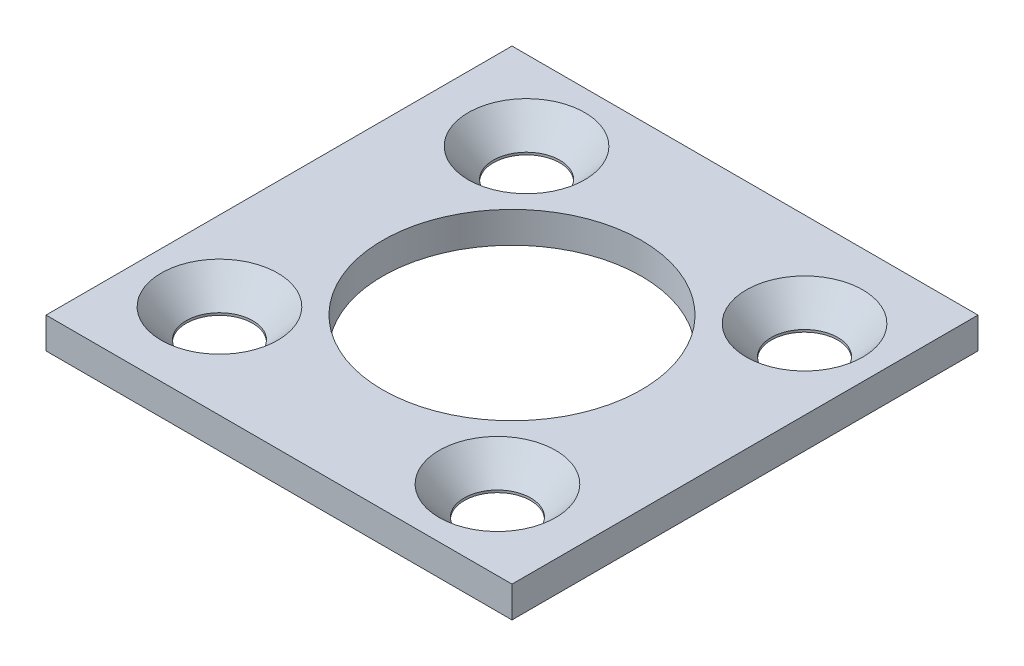
ISO-10303-21;
HEADER;
FILE_DESCRIPTION(('STEP AP214'),'2;1');
FILE_NAME('part.step','',(''),(''),'','','');
FILE_SCHEMA(('AUTOMOTIVE_DESIGN { 1 0 10303 214 1 1 1 1 }'));
ENDSEC;
DATA;
#1=APPLICATION_CONTEXT('core data for automotive mechanical design processes');
#2=APPLICATION_PROTOCOL_DEFINITION('international standard','automotive_design',2000,#1);
#3=PRODUCT_CONTEXT('',#1,'mechanical');
#4=PRODUCT('Part','Part','',(#3));
#5=PRODUCT_RELATED_PRODUCT_CATEGORY('part','',(#4));
#6=PRODUCT_DEFINITION_FORMATION('','',#4);
#7=PRODUCT_DEFINITION_CONTEXT('part definition',#1,'design');
#8=PRODUCT_DEFINITION('design','',#6,#7);
#9=PRODUCT_DEFINITION_SHAPE('','',#8);
#10=(LENGTH_UNIT() NAMED_UNIT(*) SI_UNIT(.MILLI.,.METRE.));
#11=(NAMED_UNIT(*) PLANE_ANGLE_UNIT() SI_UNIT($,.RADIAN.));
#12=(NAMED_UNIT(*) SI_UNIT($,.STERADIAN.) SOLID_ANGLE_UNIT());
#13=UNCERTAINTY_MEASURE_WITH_UNIT(LENGTH_MEASURE(1.E-05),#10,'distance_accuracy_value','');
#14=(GEOMETRIC_REPRESENTATION_CONTEXT(3) GLOBAL_UNCERTAINTY_ASSIGNED_CONTEXT((#13)) GLOBAL_UNIT_ASSIGNED_CONTEXT((#10,
#11,#12)) REPRESENTATION_CONTEXT('',''));
#15=CARTESIAN_POINT('',(0.,0.,0.));
#16=DIRECTION('',(0.,0.,1.));
#17=DIRECTION('',(1.,0.,0.));
#18=AXIS2_PLACEMENT_3D('',#15,#16,#17);
#19=CARTESIAN_POINT('',(0.,1.524,0.));
#20=DIRECTION('',(0.,1.,0.));
#21=DIRECTION('',(0.,0.,1.));
#22=AXIS2_PLACEMENT_3D('',#19,#20,#21);
#23=PLANE('',#22);
#24=CARTESIAN_POINT('',(-3.89772465493816,1.524,-18.2483889685302));
#25=DIRECTION('',(0.,1.,0.));
#26=DIRECTION('',(0.,0.,1.));
#27=AXIS2_PLACEMENT_3D('',#24,#25,#26);
#28=CIRCLE('',#27,2.8575);
#29=CARTESIAN_POINT('',(-3.89772465493816,1.524,-15.3908889685302));
#30=VERTEX_POINT('',#29);
#31=EDGE_CURVE('E150',#30,#30,#28,.T.);
#32=ORIENTED_EDGE('',*,*,#31,.F.);
#33=EDGE_LOOP('',(#32));
#34=FACE_BOUND('',#33,.T.);
#35=CARTESIAN_POINT('',(-4.61161103146986,1.524,-3.89772465493815));
#36=DIRECTION('',(0.,1.,0.));
#37=DIRECTION('',(0.,0.,1.));
#38=AXIS2_PLACEMENT_3D('',#35,#36,#37);
#39=CIRCLE('',#38,2.8575);
#40=CARTESIAN_POINT('',(-4.61161103146986,1.524,-1.04022465493815));
#41=VERTEX_POINT('',#40);
#42=EDGE_CURVE('E141',#41,#41,#39,.T.);
#43=ORIENTED_EDGE('',*,*,#42,.F.);
#44=EDGE_LOOP('',(#43));
#45=FACE_BOUND('',#44,.T.);
#46=CARTESIAN_POINT('',(-18.9622753450619,1.524,-4.61161103146984));
#47=DIRECTION('',(0.,1.,0.));
#48=DIRECTION('',(0.,0.,1.));
#49=AXIS2_PLACEMENT_3D('',#46,#47,#48);
#50=CIRCLE('',#49,2.8575);
#51=CARTESIAN_POINT('',(-18.9622753450619,1.524,-1.75411103146984));
#52=VERTEX_POINT('',#51);
#53=EDGE_CURVE('E132',#52,#52,#50,.T.);
#54=ORIENTED_EDGE('',*,*,#53,.F.);
#55=EDGE_LOOP('',(#54));
#56=FACE_BOUND('',#55,.T.);
#57=CARTESIAN_POINT('',(-18.2483889685302,1.524,-18.9622753450618));
#58=DIRECTION('',(0.,1.,0.));
#59=DIRECTION('',(0.,0.,1.));
#60=AXIS2_PLACEMENT_3D('',#57,#58,#59);
#61=CIRCLE('',#60,2.8575);
#62=CARTESIAN_POINT('',(-18.2483889685302,1.524,-16.1047753450618));
#63=VERTEX_POINT('',#62);
#64=EDGE_CURVE('E123',#63,#63,#61,.T.);
#65=ORIENTED_EDGE('',*,*,#64,.F.);
#66=EDGE_LOOP('',(#65));
#67=FACE_BOUND('',#66,.T.);
#68=DIRECTION('',(0.,0.,-1.));
#69=VECTOR('',#68,1.);
#70=CARTESIAN_POINT('',(0.,1.524,0.));
#71=LINE('',#70,#69);
#72=CARTESIAN_POINT('',(0.,1.524,0.));
#73=VERTEX_POINT('',#72);
#74=CARTESIAN_POINT('',(0.,1.524,-22.86));
#75=VERTEX_POINT('',#74);
#76=EDGE_CURVE('E85',#73,#75,#71,.T.);
#77=ORIENTED_EDGE('',*,*,#76,.T.);
#78=DIRECTION('',(-1.,0.,0.));
#79=VECTOR('',#78,1.);
#80=CARTESIAN_POINT('',(0.,1.524,-22.86));
#81=LINE('',#80,#79);
#82=CARTESIAN_POINT('',(-22.86,1.524,-22.86));
#83=VERTEX_POINT('',#82);
#84=EDGE_CURVE('E80',#75,#83,#81,.T.);
#85=ORIENTED_EDGE('',*,*,#84,.T.);
#86=DIRECTION('',(0.,0.,1.));
#87=VECTOR('',#86,1.);
#88=CARTESIAN_POINT('',(-22.86,1.524,0.));
#89=LINE('',#88,#87);
#90=CARTESIAN_POINT('',(-22.86,1.524,0.));
#91=VERTEX_POINT('',#90);
#92=EDGE_CURVE('E83',#83,#91,#89,.T.);
#93=ORIENTED_EDGE('',*,*,#92,.T.);
#94=DIRECTION('',(1.,0.,0.));
#95=VECTOR('',#94,1.);
#96=CARTESIAN_POINT('',(0.,1.524,0.));
#97=LINE('',#96,#95);
#98=EDGE_CURVE('E50',#91,#73,#97,.T.);
#99=ORIENTED_EDGE('',*,*,#98,.T.);
#100=EDGE_LOOP('',(#77,#85,#93,#99));
#101=FACE_BOUND('',#100,.T.);
#102=CARTESIAN_POINT('',(-11.43,1.524,-11.43));
#103=DIRECTION('',(0.,1.,0.));
#104=DIRECTION('',(0.,0.,1.));
#105=AXIS2_PLACEMENT_3D('',#102,#103,#104);
#106=CIRCLE('',#105,6.35);
#107=CARTESIAN_POINT('',(-11.43,1.524,-17.78));
#108=VERTEX_POINT('',#107);
#109=EDGE_CURVE('E100',#108,#108,#106,.T.);
#110=ORIENTED_EDGE('',*,*,#109,.F.);
#111=EDGE_LOOP('',(#110));
#112=FACE_BOUND('',#111,.T.);
#113=ADVANCED_FACE('F33',(#34,#45,#56,#67,#101,#112),#23,.T.);
#114=CARTESIAN_POINT('',(0.,0.,0.));
#115=DIRECTION('',(0.,1.,0.));
#116=DIRECTION('',(0.,0.,1.));
#117=AXIS2_PLACEMENT_3D('',#114,#115,#116);
#118=PLANE('',#117);
#119=CARTESIAN_POINT('',(-3.89772465493816,0.,-18.2483889685302));
#120=DIRECTION('',(0.,1.,0.));
#121=DIRECTION('',(0.,0.,1.));
#122=AXIS2_PLACEMENT_3D('',#119,#120,#121);
#123=CIRCLE('',#122,1.63195);
#124=CARTESIAN_POINT('',(-3.89772465493816,0.,-16.6164389685302));
#125=VERTEX_POINT('',#124);
#126=EDGE_CURVE('E144',#125,#125,#123,.T.);
#127=ORIENTED_EDGE('',*,*,#126,.T.);
#128=EDGE_LOOP('',(#127));
#129=FACE_BOUND('',#128,.T.);
#130=CARTESIAN_POINT('',(-4.61161103146986,0.,-3.89772465493815));
#131=DIRECTION('',(0.,1.,0.));
#132=DIRECTION('',(0.,0.,1.));
#133=AXIS2_PLACEMENT_3D('',#130,#131,#132);
#134=CIRCLE('',#133,1.63195);
#135=CARTESIAN_POINT('',(-4.61161103146986,0.,-2.26577465493815));
#136=VERTEX_POINT('',#135);
#137=EDGE_CURVE('E135',#136,#136,#134,.T.);
#138=ORIENTED_EDGE('',*,*,#137,.T.);
#139=EDGE_LOOP('',(#138));
#140=FACE_BOUND('',#139,.T.);
#141=CARTESIAN_POINT('',(-18.9622753450619,0.,-4.61161103146984));
#142=DIRECTION('',(0.,1.,0.));
#143=DIRECTION('',(0.,0.,1.));
#144=AXIS2_PLACEMENT_3D('',#141,#142,#143);
#145=CIRCLE('',#144,1.63195);
#146=CARTESIAN_POINT('',(-18.9622753450619,0.,-2.97966103146984));
#147=VERTEX_POINT('',#146);
#148=EDGE_CURVE('E126',#147,#147,#145,.T.);
#149=ORIENTED_EDGE('',*,*,#148,.T.);
#150=EDGE_LOOP('',(#149));
#151=FACE_BOUND('',#150,.T.);
#152=CARTESIAN_POINT('',(-18.2483889685302,0.,-18.9622753450618));
#153=DIRECTION('',(0.,1.,0.));
#154=DIRECTION('',(0.,0.,1.));
#155=AXIS2_PLACEMENT_3D('',#152,#153,#154);
#156=CIRCLE('',#155,1.63195);
#157=CARTESIAN_POINT('',(-18.2483889685302,0.,-17.3303253450618));
#158=VERTEX_POINT('',#157);
#159=EDGE_CURVE('E115',#158,#158,#156,.T.);
#160=ORIENTED_EDGE('',*,*,#159,.T.);
#161=EDGE_LOOP('',(#160));
#162=FACE_BOUND('',#161,.T.);
#163=DIRECTION('',(0.,0.,-1.));
#164=VECTOR('',#163,1.);
#165=CARTESIAN_POINT('',(0.,0.,0.));
#166=LINE('',#165,#164);
#167=CARTESIAN_POINT('',(0.,0.,0.));
#168=VERTEX_POINT('',#167);
#169=CARTESIAN_POINT('',(0.,0.,-22.86));
#170=VERTEX_POINT('',#169);
#171=EDGE_CURVE('E97',#168,#170,#166,.T.);
#172=ORIENTED_EDGE('',*,*,#171,.F.);
#173=DIRECTION('',(1.,0.,0.));
#174=VECTOR('',#173,1.);
#175=CARTESIAN_POINT('',(0.,0.,0.));
#176=LINE('',#175,#174);
#177=CARTESIAN_POINT('',(-22.86,0.,0.));
#178=VERTEX_POINT('',#177);
#179=EDGE_CURVE('E73',#178,#168,#176,.T.);
#180=ORIENTED_EDGE('',*,*,#179,.F.);
#181=DIRECTION('',(0.,0.,1.));
#182=VECTOR('',#181,1.);
#183=CARTESIAN_POINT('',(-22.86,0.,0.));
#184=LINE('',#183,#182);
#185=CARTESIAN_POINT('',(-22.86,0.,-22.86));
#186=VERTEX_POINT('',#185);
#187=EDGE_CURVE('E67',#186,#178,#184,.T.);
#188=ORIENTED_EDGE('',*,*,#187,.F.);
#189=DIRECTION('',(-1.,0.,0.));
#190=VECTOR('',#189,1.);
#191=CARTESIAN_POINT('',(0.,0.,-22.86));
#192=LINE('',#191,#190);
#193=EDGE_CURVE('E89',#170,#186,#192,.T.);
#194=ORIENTED_EDGE('',*,*,#193,.F.);
#195=EDGE_LOOP('',(#172,#180,#188,#194));
#196=FACE_BOUND('',#195,.T.);
#197=CARTESIAN_POINT('',(-11.43,0.,-11.43));
#198=DIRECTION('',(0.,1.,0.));
#199=DIRECTION('',(0.,0.,1.));
#200=AXIS2_PLACEMENT_3D('',#197,#198,#199);
#201=CIRCLE('',#200,6.35);
#202=CARTESIAN_POINT('',(-11.43,0.,-17.78));
#203=VERTEX_POINT('',#202);
#204=EDGE_CURVE('E112',#203,#203,#201,.T.);
#205=ORIENTED_EDGE('',*,*,#204,.T.);
#206=EDGE_LOOP('',(#205));
#207=FACE_BOUND('',#206,.T.);
#208=ADVANCED_FACE('F108',(#129,#140,#151,#162,#196,#207),#118,.F.);
#209=CARTESIAN_POINT('',(0.,1.524,0.));
#210=DIRECTION('',(-1.,0.,0.));
#211=DIRECTION('',(0.,0.,1.));
#212=AXIS2_PLACEMENT_3D('',#209,#210,#211);
#213=PLANE('',#212);
#214=ORIENTED_EDGE('',*,*,#171,.T.);
#215=DIRECTION('',(0.,-1.,0.));
#216=VECTOR('',#215,1.);
#217=CARTESIAN_POINT('',(0.,1.524,-22.86));
#218=LINE('',#217,#216);
#219=EDGE_CURVE('E11',#75,#170,#218,.T.);
#220=ORIENTED_EDGE('',*,*,#219,.F.);
#221=ORIENTED_EDGE('',*,*,#76,.F.);
#222=DIRECTION('',(0.,-1.,0.));
#223=VECTOR('',#222,1.);
#224=CARTESIAN_POINT('',(0.,1.524,0.));
#225=LINE('',#224,#223);
#226=EDGE_CURVE('E93',#73,#168,#225,.T.);
#227=ORIENTED_EDGE('',*,*,#226,.T.);
#228=EDGE_LOOP('',(#214,#220,#221,#227));
#229=FACE_BOUND('',#228,.T.);
#230=ADVANCED_FACE('F35',(#229),#213,.F.);
#231=CARTESIAN_POINT('',(0.,1.524,-22.86));
#232=DIRECTION('',(0.,0.,1.));
#233=DIRECTION('',(1.,0.,0.));
#234=AXIS2_PLACEMENT_3D('',#231,#232,#233);
#235=PLANE('',#234);
#236=ORIENTED_EDGE('',*,*,#193,.T.);
#237=DIRECTION('',(0.,-1.,0.));
#238=VECTOR('',#237,1.);
#239=CARTESIAN_POINT('',(-22.86,1.524,-22.86));
#240=LINE('',#239,#238);
#241=EDGE_CURVE('E42',#83,#186,#240,.T.);
#242=ORIENTED_EDGE('',*,*,#241,.F.);
#243=ORIENTED_EDGE('',*,*,#84,.F.);
#244=ORIENTED_EDGE('',*,*,#219,.T.);
#245=EDGE_LOOP('',(#236,#242,#243,#244));
#246=FACE_BOUND('',#245,.T.);
#247=ADVANCED_FACE('F88',(#246),#235,.F.);
#248=CARTESIAN_POINT('',(-22.86,1.524,0.));
#249=DIRECTION('',(1.,0.,0.));
#250=DIRECTION('',(0.,0.,-1.));
#251=AXIS2_PLACEMENT_3D('',#248,#249,#250);
#252=PLANE('',#251);
#253=ORIENTED_EDGE('',*,*,#187,.T.);
#254=DIRECTION('',(0.,-1.,0.));
#255=VECTOR('',#254,1.);
#256=CARTESIAN_POINT('',(-22.86,1.524,0.));
#257=LINE('',#256,#255);
#258=EDGE_CURVE('E90',#91,#178,#257,.T.);
#259=ORIENTED_EDGE('',*,*,#258,.F.);
#260=ORIENTED_EDGE('',*,*,#92,.F.);
#261=ORIENTED_EDGE('',*,*,#241,.T.);
#262=EDGE_LOOP('',(#253,#259,#260,#261));
#263=FACE_BOUND('',#262,.T.);
#264=ADVANCED_FACE('F91',(#263),#252,.F.);
#265=CARTESIAN_POINT('',(0.,1.524,0.));
#266=DIRECTION('',(0.,0.,-1.));
#267=DIRECTION('',(-1.,0.,0.));
#268=AXIS2_PLACEMENT_3D('',#265,#266,#267);
#269=PLANE('',#268);
#270=ORIENTED_EDGE('',*,*,#179,.T.);
#271=ORIENTED_EDGE('',*,*,#226,.F.);
#272=ORIENTED_EDGE('',*,*,#98,.F.);
#273=ORIENTED_EDGE('',*,*,#258,.T.);
#274=EDGE_LOOP('',(#270,#271,#272,#273));
#275=FACE_BOUND('',#274,.T.);
#276=ADVANCED_FACE('F105',(#275),#269,.F.);
#277=CARTESIAN_POINT('',(-11.43,1.524,-11.43));
#278=DIRECTION('',(0.,-1.,0.));
#279=DIRECTION('',(0.,0.,-1.));
#280=AXIS2_PLACEMENT_3D('',#277,#278,#279);
#281=CYLINDRICAL_SURFACE('',#280,6.35);
#282=CARTESIAN_POINT('',(-11.43,1.524,-17.78));
#283=CARTESIAN_POINT('',(-11.43,1.508125,-17.78));
#284=CARTESIAN_POINT('',(-11.43,1.49225,-17.78));
#285=CARTESIAN_POINT('',(-11.43,1.4605,-17.78));
#286=CARTESIAN_POINT('',(-11.43,1.444625,-17.78));
#287=CARTESIAN_POINT('',(-11.43,1.412875,-17.78));
#288=CARTESIAN_POINT('',(-11.43,1.397,-17.78));
#289=CARTESIAN_POINT('',(-11.43,1.36525,-17.78));
#290=CARTESIAN_POINT('',(-11.43,1.349375,-17.78));
#291=CARTESIAN_POINT('',(-11.43,1.317625,-17.78));
#292=CARTESIAN_POINT('',(-11.43,1.30175,-17.78));
#293=CARTESIAN_POINT('',(-11.43,1.27,-17.78));
#294=CARTESIAN_POINT('',(-11.43,1.254125,-17.78));
#295=CARTESIAN_POINT('',(-11.43,1.222375,-17.78));
#296=CARTESIAN_POINT('',(-11.43,1.2065,-17.78));
#297=CARTESIAN_POINT('',(-11.43,1.17475,-17.78));
#298=CARTESIAN_POINT('',(-11.43,1.158875,-17.78));
#299=CARTESIAN_POINT('',(-11.43,1.127125,-17.78));
#300=CARTESIAN_POINT('',(-11.43,1.11125,-17.78));
#301=CARTESIAN_POINT('',(-11.43,1.0795,-17.78));
#302=CARTESIAN_POINT('',(-11.43,1.063625,-17.78));
#303=CARTESIAN_POINT('',(-11.43,1.031875,-17.78));
#304=CARTESIAN_POINT('',(-11.43,1.016,-17.78));
#305=CARTESIAN_POINT('',(-11.43,0.98425,-17.78));
#306=CARTESIAN_POINT('',(-11.43,0.968375,-17.78));
#307=CARTESIAN_POINT('',(-11.43,0.936625,-17.78));
#308=CARTESIAN_POINT('',(-11.43,0.92075,-17.78));
#309=CARTESIAN_POINT('',(-11.43,0.889,-17.78));
#310=CARTESIAN_POINT('',(-11.43,0.873125,-17.78));
#311=CARTESIAN_POINT('',(-11.43,0.841375,-17.78));
#312=CARTESIAN_POINT('',(-11.43,0.8255,-17.78));
#313=CARTESIAN_POINT('',(-11.43,0.79375,-17.78));
#314=CARTESIAN_POINT('',(-11.43,0.777875,-17.78));
#315=CARTESIAN_POINT('',(-11.43,0.746125,-17.78));
#316=CARTESIAN_POINT('',(-11.43,0.73025,-17.78));
#317=CARTESIAN_POINT('',(-11.43,0.6985,-17.78));
#318=CARTESIAN_POINT('',(-11.43,0.682625,-17.78));
#319=CARTESIAN_POINT('',(-11.43,0.650875,-17.78));
#320=CARTESIAN_POINT('',(-11.43,0.635,-17.78));
#321=CARTESIAN_POINT('',(-11.43,0.60325,-17.78));
#322=CARTESIAN_POINT('',(-11.43,0.587375,-17.78));
#323=CARTESIAN_POINT('',(-11.43,0.555625,-17.78));
#324=CARTESIAN_POINT('',(-11.43,0.53975,-17.78));
#325=CARTESIAN_POINT('',(-11.43,0.508,-17.78));
#326=CARTESIAN_POINT('',(-11.43,0.492125,-17.78));
#327=CARTESIAN_POINT('',(-11.43,0.460375,-17.78));
#328=CARTESIAN_POINT('',(-11.43,0.4445,-17.78));
#329=CARTESIAN_POINT('',(-11.43,0.41275,-17.78));
#330=CARTESIAN_POINT('',(-11.43,0.396875,-17.78));
#331=CARTESIAN_POINT('',(-11.43,0.365125,-17.78));
#332=CARTESIAN_POINT('',(-11.43,0.34925,-17.78));
#333=CARTESIAN_POINT('',(-11.43,0.3175,-17.78));
#334=CARTESIAN_POINT('',(-11.43,0.301625,-17.78));
#335=CARTESIAN_POINT('',(-11.43,0.269875,-17.78));
#336=CARTESIAN_POINT('',(-11.43,0.254,-17.78));
#337=CARTESIAN_POINT('',(-11.43,0.22225,-17.78));
#338=CARTESIAN_POINT('',(-11.43,0.206375,-17.78));
#339=CARTESIAN_POINT('',(-11.43,0.174625,-17.78));
#340=CARTESIAN_POINT('',(-11.43,0.15875,-17.78));
#341=CARTESIAN_POINT('',(-11.43,0.127,-17.78));
#342=CARTESIAN_POINT('',(-11.43,0.111125,-17.78));
#343=CARTESIAN_POINT('',(-11.43,0.079375,-17.78));
#344=CARTESIAN_POINT('',(-11.43,0.0635,-17.78));
#345=CARTESIAN_POINT('',(-11.43,0.0317499999999999,-17.78));
#346=CARTESIAN_POINT('',(-11.43,0.015875,-17.78));
#347=CARTESIAN_POINT('',(-11.43,0.,-17.78));
#348=B_SPLINE_CURVE_WITH_KNOTS('',3,(#282,#283,#284,#285,#286,#287,#288,#289,#290,#291,#292,
#293,#294,#295,#296,#297,#298,#299,#300,#301,#302,#303,#304,#305,#306,#307,#308,#309,#310,#311,
#312,#313,#314,#315,#316,#317,#318,#319,#320,#321,#322,#323,#324,#325,#326,#327,#328,#329,#330,
#331,#332,#333,#334,#335,#336,#337,#338,#339,#340,#341,#342,#343,#344,#345,#346,#347),
.UNSPECIFIED.,.F.,.F.,(4,2,2,2,2,2,2,2,2,2,2,2,2,2,2,2,2,2,2,2,2,2,2,2,2,2,2,2,2,2,2,2,4),(0.,
0.0476250000000001,0.0952500000000001,0.142875,0.1905,0.238125,0.28575,0.333375,0.381,0.428625,
0.47625,0.523875,0.5715,0.619125,0.66675,0.714375,0.762,0.809625,0.85725,0.904875,0.9525,
1.000125,1.04775,1.095375,1.143,1.190625,1.23825,1.285875,1.3335,1.381125,1.42875,1.476375,
1.524),.UNSPECIFIED.);
#349=EDGE_CURVE('BSEAM178',#108,#203,#348,.T.);
#350=ORIENTED_EDGE('',*,*,#109,.T.);
#351=ORIENTED_EDGE('',*,*,#204,.F.);
#352=ORIENTED_EDGE('',*,*,#349,.T.);
#353=ORIENTED_EDGE('',*,*,#349,.F.);
#354=EDGE_LOOP('',(#350,#352,#351,#353));
#355=FACE_BOUND('',#354,.T.);
#356=ADVANCED_FACE('F178',(#355),#281,.F.);
#357=CARTESIAN_POINT('',(-18.2483889685302,1.524,-18.9622753450618));
#358=DIRECTION('',(0.,1.,0.));
#359=DIRECTION('',(0.,0.,1.));
#360=AXIS2_PLACEMENT_3D('',#357,#358,#359);
#361=CYLINDRICAL_SURFACE('',#360,1.63195);
#362=ORIENTED_EDGE('',*,*,#159,.F.);
#363=EDGE_LOOP('',(#362));
#364=FACE_BOUND('',#363,.T.);
#365=CARTESIAN_POINT('',(-18.2483889685302,0.114165998530291,-18.9622753450618));
#366=DIRECTION('',(0.,1.,0.));
#367=DIRECTION('',(0.,0.,1.));
#368=AXIS2_PLACEMENT_3D('',#365,#366,#367);
#369=CIRCLE('',#368,1.63195);
#370=CARTESIAN_POINT('',(-18.2483889685302,0.114165998530291,-17.3303253450618));
#371=VERTEX_POINT('',#370);
#372=EDGE_CURVE('E120',#371,#371,#369,.T.);
#373=ORIENTED_EDGE('',*,*,#372,.T.);
#374=EDGE_LOOP('',(#373));
#375=FACE_BOUND('',#374,.T.);
#376=ADVANCED_FACE('F168',(#364,#375),#361,.F.);
#377=CARTESIAN_POINT('',(-18.2483889685302,1.524,-18.9622753450618));
#378=DIRECTION('',(0.,1.,0.));
#379=DIRECTION('',(0.,0.,1.));
#380=AXIS2_PLACEMENT_3D('',#377,#378,#379);
#381=CONICAL_SURFACE('',#380,2.8575,0.715584993317674);
#382=ORIENTED_EDGE('',*,*,#372,.F.);
#383=EDGE_LOOP('',(#382));
#384=FACE_BOUND('',#383,.T.);
#385=ORIENTED_EDGE('',*,*,#64,.T.);
#386=EDGE_LOOP('',(#385));
#387=FACE_BOUND('',#386,.T.);
#388=ADVANCED_FACE('F165',(#384,#387),#381,.F.);
#389=CARTESIAN_POINT('',(-18.9622753450619,1.524,-4.61161103146984));
#390=DIRECTION('',(0.,1.,0.));
#391=DIRECTION('',(0.,0.,1.));
#392=AXIS2_PLACEMENT_3D('',#389,#390,#391);
#393=CYLINDRICAL_SURFACE('',#392,1.63195);
#394=ORIENTED_EDGE('',*,*,#148,.F.);
#395=EDGE_LOOP('',(#394));
#396=FACE_BOUND('',#395,.T.);
#397=CARTESIAN_POINT('',(-18.9622753450619,0.114165998530291,-4.61161103146984));
#398=DIRECTION('',(0.,1.,0.));
#399=DIRECTION('',(0.,0.,1.));
#400=AXIS2_PLACEMENT_3D('',#397,#398,#399);
#401=CIRCLE('',#400,1.63195);
#402=CARTESIAN_POINT('',(-18.9622753450619,0.114165998530291,-2.97966103146984));
#403=VERTEX_POINT('',#402);
#404=EDGE_CURVE('E129',#403,#403,#401,.T.);
#405=ORIENTED_EDGE('',*,*,#404,.T.);
#406=EDGE_LOOP('',(#405));
#407=FACE_BOUND('',#406,.T.);
#408=ADVANCED_FACE('F167',(#396,#407),#393,.F.);
#409=CARTESIAN_POINT('',(-18.9622753450619,1.524,-4.61161103146984));
#410=DIRECTION('',(0.,1.,0.));
#411=DIRECTION('',(0.,0.,1.));
#412=AXIS2_PLACEMENT_3D('',#409,#410,#411);
#413=CONICAL_SURFACE('',#412,2.8575,0.715584993317674);
#414=ORIENTED_EDGE('',*,*,#404,.F.);
#415=EDGE_LOOP('',(#414));
#416=FACE_BOUND('',#415,.T.);
#417=ORIENTED_EDGE('',*,*,#53,.T.);
#418=EDGE_LOOP('',(#417));
#419=FACE_BOUND('',#418,.T.);
#420=ADVANCED_FACE('F175',(#416,#419),#413,.F.);
#421=CARTESIAN_POINT('',(-4.61161103146986,1.524,-3.89772465493815));
#422=DIRECTION('',(0.,1.,0.));
#423=DIRECTION('',(0.,0.,1.));
#424=AXIS2_PLACEMENT_3D('',#421,#422,#423);
#425=CYLINDRICAL_SURFACE('',#424,1.63195);
#426=ORIENTED_EDGE('',*,*,#137,.F.);
#427=EDGE_LOOP('',(#426));
#428=FACE_BOUND('',#427,.T.);
#429=CARTESIAN_POINT('',(-4.61161103146986,0.114165998530291,-3.89772465493815));
#430=DIRECTION('',(0.,1.,0.));
#431=DIRECTION('',(0.,0.,1.));
#432=AXIS2_PLACEMENT_3D('',#429,#430,#431);
#433=CIRCLE('',#432,1.63195);
#434=CARTESIAN_POINT('',(-4.61161103146986,0.114165998530291,-2.26577465493815));
#435=VERTEX_POINT('',#434);
#436=EDGE_CURVE('E138',#435,#435,#433,.T.);
#437=ORIENTED_EDGE('',*,*,#436,.T.);
#438=EDGE_LOOP('',(#437));
#439=FACE_BOUND('',#438,.T.);
#440=ADVANCED_FACE('F258',(#428,#439),#425,.F.);
#441=CARTESIAN_POINT('',(-4.61161103146986,1.524,-3.89772465493815));
#442=DIRECTION('',(0.,1.,0.));
#443=DIRECTION('',(0.,0.,1.));
#444=AXIS2_PLACEMENT_3D('',#441,#442,#443);
#445=CONICAL_SURFACE('',#444,2.8575,0.715584993317675);
#446=ORIENTED_EDGE('',*,*,#436,.F.);
#447=EDGE_LOOP('',(#446));
#448=FACE_BOUND('',#447,.T.);
#449=ORIENTED_EDGE('',*,*,#42,.T.);
#450=EDGE_LOOP('',(#449));
#451=FACE_BOUND('',#450,.T.);
#452=ADVANCED_FACE('F267',(#448,#451),#445,.F.);
#453=CARTESIAN_POINT('',(-3.89772465493816,1.524,-18.2483889685302));
#454=DIRECTION('',(0.,1.,0.));
#455=DIRECTION('',(0.,0.,1.));
#456=AXIS2_PLACEMENT_3D('',#453,#454,#455);
#457=CYLINDRICAL_SURFACE('',#456,1.63195);
#458=ORIENTED_EDGE('',*,*,#126,.F.);
#459=EDGE_LOOP('',(#458));
#460=FACE_BOUND('',#459,.T.);
#461=CARTESIAN_POINT('',(-3.89772465493816,0.114165998530291,-18.2483889685302));
#462=DIRECTION('',(0.,1.,0.));
#463=DIRECTION('',(0.,0.,1.));
#464=AXIS2_PLACEMENT_3D('',#461,#462,#463);
#465=CIRCLE('',#464,1.63195);
#466=CARTESIAN_POINT('',(-3.89772465493816,0.114165998530291,-16.6164389685302));
#467=VERTEX_POINT('',#466);
#468=EDGE_CURVE('E147',#467,#467,#465,.T.);
#469=ORIENTED_EDGE('',*,*,#468,.T.);
#470=EDGE_LOOP('',(#469));
#471=FACE_BOUND('',#470,.T.);
#472=ADVANCED_FACE('F277',(#460,#471),#457,.F.);
#473=CARTESIAN_POINT('',(-3.89772465493816,1.524,-18.2483889685302));
#474=DIRECTION('',(0.,1.,0.));
#475=DIRECTION('',(0.,0.,1.));
#476=AXIS2_PLACEMENT_3D('',#473,#474,#475);
#477=CONICAL_SURFACE('',#476,2.8575,0.715584993317675);
#478=ORIENTED_EDGE('',*,*,#468,.F.);
#479=EDGE_LOOP('',(#478));
#480=FACE_BOUND('',#479,.T.);
#481=ORIENTED_EDGE('',*,*,#31,.T.);
#482=EDGE_LOOP('',(#481));
#483=FACE_BOUND('',#482,.T.);
#484=ADVANCED_FACE('F154',(#480,#483),#477,.F.);
#485=CLOSED_SHELL('',(#113,#208,#230,#247,#264,#276,#356,#376,#388,#408,#420,#440,#452,#472,#484));
#486=MANIFOLD_SOLID_BREP('B2',#485);
#487=ADVANCED_BREP_SHAPE_REPRESENTATION('',(#18,#486),#14);
#488=SHAPE_DEFINITION_REPRESENTATION(#9,#487);
ENDSEC;
END-ISO-10303-21;
